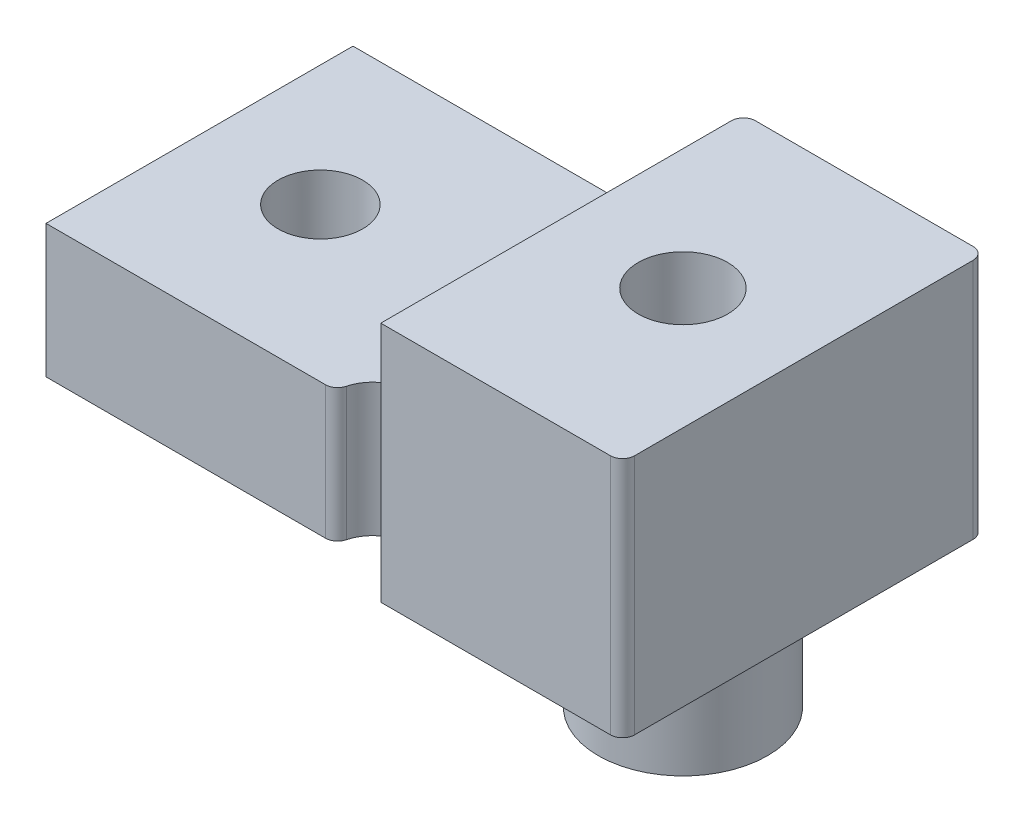
ISO-10303-21;
HEADER;
FILE_DESCRIPTION(('STEP AP214'),'2;1');
FILE_NAME('part.step','',(''),(''),'','','');
FILE_SCHEMA(('AUTOMOTIVE_DESIGN { 1 0 10303 214 1 1 1 1 }'));
ENDSEC;
DATA;
#1=APPLICATION_CONTEXT('core data for automotive mechanical design processes');
#2=APPLICATION_PROTOCOL_DEFINITION('international standard','automotive_design',2000,#1);
#3=PRODUCT_CONTEXT('',#1,'mechanical');
#4=PRODUCT('Part','Part','',(#3));
#5=PRODUCT_RELATED_PRODUCT_CATEGORY('part','',(#4));
#6=PRODUCT_DEFINITION_FORMATION('','',#4);
#7=PRODUCT_DEFINITION_CONTEXT('part definition',#1,'design');
#8=PRODUCT_DEFINITION('design','',#6,#7);
#9=PRODUCT_DEFINITION_SHAPE('','',#8);
#10=(LENGTH_UNIT() NAMED_UNIT(*) SI_UNIT(.MILLI.,.METRE.));
#11=(NAMED_UNIT(*) PLANE_ANGLE_UNIT() SI_UNIT($,.RADIAN.));
#12=(NAMED_UNIT(*) SI_UNIT($,.STERADIAN.) SOLID_ANGLE_UNIT());
#13=UNCERTAINTY_MEASURE_WITH_UNIT(LENGTH_MEASURE(1.E-05),#10,'distance_accuracy_value','');
#14=(GEOMETRIC_REPRESENTATION_CONTEXT(3) GLOBAL_UNCERTAINTY_ASSIGNED_CONTEXT((#13)) GLOBAL_UNIT_ASSIGNED_CONTEXT((#10,
#11,#12)) REPRESENTATION_CONTEXT('',''));
#15=CARTESIAN_POINT('',(0.,0.,0.));
#16=DIRECTION('',(0.,0.,1.));
#17=DIRECTION('',(1.,0.,0.));
#18=AXIS2_PLACEMENT_3D('',#15,#16,#17);
#19=CARTESIAN_POINT('',(20.,10.,-6.35));
#20=DIRECTION('',(0.,-1.,0.));
#21=DIRECTION('',(0.,0.,-1.));
#22=AXIS2_PLACEMENT_3D('',#19,#20,#21);
#23=CYLINDRICAL_SURFACE('',#22,1.85);
#24=CARTESIAN_POINT('',(20.,10.,-6.35));
#25=DIRECTION('',(0.,-1.,0.));
#26=DIRECTION('',(0.,0.,-1.));
#27=AXIS2_PLACEMENT_3D('',#24,#25,#26);
#28=CIRCLE('',#27,1.85);
#29=CARTESIAN_POINT('',(20.,10.,-8.2));
#30=VERTEX_POINT('',#29);
#31=EDGE_CURVE('E532',#30,#30,#28,.T.);
#32=ORIENTED_EDGE('',*,*,#31,.F.);
#33=EDGE_LOOP('',(#32));
#34=FACE_BOUND('',#33,.T.);
#35=CARTESIAN_POINT('',(20.,-0.999999999999999,-6.35));
#36=DIRECTION('',(0.,-1.,0.));
#37=DIRECTION('',(0.,0.,-1.));
#38=AXIS2_PLACEMENT_3D('',#35,#36,#37);
#39=CIRCLE('',#38,1.85);
#40=CARTESIAN_POINT('',(20.,-0.999999999999999,-8.2));
#41=VERTEX_POINT('',#40);
#42=EDGE_CURVE('E38',#41,#41,#39,.F.);
#43=ORIENTED_EDGE('',*,*,#42,.F.);
#44=EDGE_LOOP('',(#43));
#45=FACE_BOUND('',#44,.T.);
#46=ADVANCED_FACE('F34',(#34,#45),#23,.F.);
#47=CARTESIAN_POINT('',(13.5,0.,-12.7));
#48=DIRECTION('',(0.,-1.,0.));
#49=DIRECTION('',(0.,0.,-1.));
#50=AXIS2_PLACEMENT_3D('',#47,#48,#49);
#51=PLANE('',#50);
#52=DIRECTION('',(-1.,0.,0.));
#53=VECTOR('',#52,1.);
#54=CARTESIAN_POINT('',(0.,0.,-12.7));
#55=LINE('',#54,#53);
#56=CARTESIAN_POINT('',(11.5635083268963,0.,-12.7));
#57=VERTEX_POINT('',#56);
#58=CARTESIAN_POINT('',(0.,0.,-12.7));
#59=VERTEX_POINT('',#58);
#60=EDGE_CURVE('E254',#57,#59,#55,.T.);
#61=ORIENTED_EDGE('',*,*,#60,.F.);
#62=CARTESIAN_POINT('',(11.5635083268963,0.,-12.2));
#63=DIRECTION('',(0.,-1.,0.));
#64=DIRECTION('',(0.,0.,-1.));
#65=AXIS2_PLACEMENT_3D('',#62,#63,#64);
#66=CIRCLE('',#65,0.5);
#67=CARTESIAN_POINT('',(12.0476312451722,0.,-12.325));
#68=VERTEX_POINT('',#67);
#69=EDGE_CURVE('E191',#57,#68,#66,.T.);
#70=ORIENTED_EDGE('',*,*,#69,.T.);
#71=CARTESIAN_POINT('',(13.5,0.,-12.7));
#72=DIRECTION('',(0.,-1.,0.));
#73=DIRECTION('',(0.,0.,-1.));
#74=AXIS2_PLACEMENT_3D('',#71,#72,#73);
#75=CIRCLE('',#74,1.5);
#76=CARTESIAN_POINT('',(15.,0.,-12.7));
#77=VERTEX_POINT('',#76);
#78=EDGE_CURVE('E251',#77,#68,#75,.T.);
#79=ORIENTED_EDGE('',*,*,#78,.F.);
#80=DIRECTION('',(0.,0.,1.));
#81=VECTOR('',#80,1.);
#82=CARTESIAN_POINT('',(15.,0.,-13.85));
#83=LINE('',#82,#81);
#84=CARTESIAN_POINT('',(15.,0.,-13.35));
#85=VERTEX_POINT('',#84);
#86=EDGE_CURVE('E249',#85,#77,#83,.T.);
#87=ORIENTED_EDGE('',*,*,#86,.F.);
#88=CARTESIAN_POINT('',(15.5,0.,-13.35));
#89=DIRECTION('',(0.,-1.,0.));
#90=DIRECTION('',(0.,0.,-1.));
#91=AXIS2_PLACEMENT_3D('',#88,#89,#90);
#92=CIRCLE('',#91,0.5);
#93=CARTESIAN_POINT('',(15.5,0.,-13.85));
#94=VERTEX_POINT('',#93);
#95=EDGE_CURVE('E189',#85,#94,#92,.T.);
#96=ORIENTED_EDGE('',*,*,#95,.T.);
#97=DIRECTION('',(-1.,0.,0.));
#98=VECTOR('',#97,1.);
#99=CARTESIAN_POINT('',(15.,0.,-13.85));
#100=LINE('',#99,#98);
#101=CARTESIAN_POINT('',(24.5,0.,-13.85));
#102=VERTEX_POINT('',#101);
#103=EDGE_CURVE('E246',#102,#94,#100,.T.);
#104=ORIENTED_EDGE('',*,*,#103,.F.);
#105=CARTESIAN_POINT('',(24.5,0.,-13.35));
#106=DIRECTION('',(0.,-1.,0.));
#107=DIRECTION('',(0.,0.,-1.));
#108=AXIS2_PLACEMENT_3D('',#105,#106,#107);
#109=CIRCLE('',#108,0.5);
#110=CARTESIAN_POINT('',(25.,0.,-13.35));
#111=VERTEX_POINT('',#110);
#112=EDGE_CURVE('E187',#102,#111,#109,.T.);
#113=ORIENTED_EDGE('',*,*,#112,.T.);
#114=DIRECTION('',(0.,0.,-1.));
#115=VECTOR('',#114,1.);
#116=CARTESIAN_POINT('',(25.,0.,1.15));
#117=LINE('',#116,#115);
#118=CARTESIAN_POINT('',(25.,0.,0.65));
#119=VERTEX_POINT('',#118);
#120=EDGE_CURVE('E244',#119,#111,#117,.T.);
#121=ORIENTED_EDGE('',*,*,#120,.F.);
#122=CARTESIAN_POINT('',(24.5,0.,0.65));
#123=DIRECTION('',(0.,-1.,0.));
#124=DIRECTION('',(0.,0.,-1.));
#125=AXIS2_PLACEMENT_3D('',#122,#123,#124);
#126=CIRCLE('',#125,0.5);
#127=CARTESIAN_POINT('',(24.5,0.,1.15));
#128=VERTEX_POINT('',#127);
#129=EDGE_CURVE('E185',#119,#128,#126,.T.);
#130=ORIENTED_EDGE('',*,*,#129,.T.);
#131=DIRECTION('',(1.,0.,0.));
#132=VECTOR('',#131,1.);
#133=CARTESIAN_POINT('',(15.,0.,1.15));
#134=LINE('',#133,#132);
#135=CARTESIAN_POINT('',(15.,0.,1.15));
#136=VERTEX_POINT('',#135);
#137=EDGE_CURVE('E237',#136,#128,#134,.T.);
#138=ORIENTED_EDGE('',*,*,#137,.F.);
#139=DIRECTION('',(0.,0.,1.));
#140=VECTOR('',#139,1.);
#141=CARTESIAN_POINT('',(15.,0.,1.15));
#142=LINE('',#141,#140);
#143=CARTESIAN_POINT('',(15.,0.,0.));
#144=VERTEX_POINT('',#143);
#145=EDGE_CURVE('E234',#144,#136,#142,.T.);
#146=ORIENTED_EDGE('',*,*,#145,.F.);
#147=CARTESIAN_POINT('',(13.5,0.,0.));
#148=DIRECTION('',(0.,-1.,0.));
#149=DIRECTION('',(0.,0.,1.));
#150=AXIS2_PLACEMENT_3D('',#147,#148,#149);
#151=CIRCLE('',#150,1.5);
#152=CARTESIAN_POINT('',(12.0476312451722,0.,-0.374999999999998));
#153=VERTEX_POINT('',#152);
#154=EDGE_CURVE('E225',#153,#144,#151,.T.);
#155=ORIENTED_EDGE('',*,*,#154,.F.);
#156=CARTESIAN_POINT('',(11.5635083268963,0.,-0.499999999999998));
#157=DIRECTION('',(0.,-1.,0.));
#158=DIRECTION('',(0.,0.,-1.));
#159=AXIS2_PLACEMENT_3D('',#156,#157,#158);
#160=CIRCLE('',#159,0.5);
#161=CARTESIAN_POINT('',(11.5635083268963,0.,0.));
#162=VERTEX_POINT('',#161);
#163=EDGE_CURVE('E173',#153,#162,#160,.T.);
#164=ORIENTED_EDGE('',*,*,#163,.T.);
#165=DIRECTION('',(1.,0.,0.));
#166=VECTOR('',#165,1.);
#167=CARTESIAN_POINT('',(0.,0.,0.));
#168=LINE('',#167,#166);
#169=CARTESIAN_POINT('',(0.,0.,0.));
#170=VERTEX_POINT('',#169);
#171=EDGE_CURVE('E235',#170,#162,#168,.T.);
#172=ORIENTED_EDGE('',*,*,#171,.F.);
#173=DIRECTION('',(0.,0.,1.));
#174=VECTOR('',#173,1.);
#175=CARTESIAN_POINT('',(0.,0.,0.));
#176=LINE('',#175,#174);
#177=EDGE_CURVE('E168',#59,#170,#176,.T.);
#178=ORIENTED_EDGE('',*,*,#177,.F.);
#179=EDGE_LOOP('',(#61,#70,#79,#87,#96,#104,#113,#121,#130,#138,#146,#155,#164,#172,#178));
#180=FACE_BOUND('',#179,.T.);
#181=CARTESIAN_POINT('',(5.,0.,-6.35));
#182=DIRECTION('',(0.,1.,0.));
#183=DIRECTION('',(0.,0.,1.));
#184=AXIS2_PLACEMENT_3D('',#181,#182,#183);
#185=CIRCLE('',#184,1.75);
#186=CARTESIAN_POINT('',(5.,0.,-4.6));
#187=VERTEX_POINT('',#186);
#188=EDGE_CURVE('E283',#187,#187,#185,.T.);
#189=ORIENTED_EDGE('',*,*,#188,.T.);
#190=EDGE_LOOP('',(#189));
#191=FACE_BOUND('',#190,.T.);
#192=CARTESIAN_POINT('',(20.,0.,-6.35));
#193=DIRECTION('',(0.,-1.,0.));
#194=DIRECTION('',(0.,0.,-1.));
#195=AXIS2_PLACEMENT_3D('',#192,#193,#194);
#196=CIRCLE('',#195,3.5);
#197=CARTESIAN_POINT('',(20.,0.,-9.85));
#198=VERTEX_POINT('',#197);
#199=EDGE_CURVE('E535',#198,#198,#196,.T.);
#200=ORIENTED_EDGE('',*,*,#199,.F.);
#201=EDGE_LOOP('',(#200));
#202=FACE_BOUND('',#201,.T.);
#203=ADVANCED_FACE('F231',(#180,#191,#202),#51,.T.);
#204=CARTESIAN_POINT('',(13.5,10.,-12.7));
#205=DIRECTION('',(0.,-1.,0.));
#206=DIRECTION('',(0.,0.,-1.));
#207=AXIS2_PLACEMENT_3D('',#204,#205,#206);
#208=PLANE('',#207);
#209=ORIENTED_EDGE('',*,*,#31,.T.);
#210=EDGE_LOOP('',(#209));
#211=FACE_BOUND('',#210,.T.);
#212=DIRECTION('',(-1.,0.,0.));
#213=VECTOR('',#212,1.);
#214=CARTESIAN_POINT('',(15.,10.,-13.85));
#215=LINE('',#214,#213);
#216=CARTESIAN_POINT('',(24.5,10.,-13.85));
#217=VERTEX_POINT('',#216);
#218=CARTESIAN_POINT('',(15.5,10.,-13.85));
#219=VERTEX_POINT('',#218);
#220=EDGE_CURVE('E260',#217,#219,#215,.T.);
#221=ORIENTED_EDGE('',*,*,#220,.T.);
#222=CARTESIAN_POINT('',(15.5,10.,-13.35));
#223=DIRECTION('',(0.,-1.,0.));
#224=DIRECTION('',(0.,0.,-1.));
#225=AXIS2_PLACEMENT_3D('',#222,#223,#224);
#226=CIRCLE('',#225,0.5);
#227=CARTESIAN_POINT('',(15.,10.,-13.35));
#228=VERTEX_POINT('',#227);
#229=EDGE_CURVE('E210',#219,#228,#226,.F.);
#230=ORIENTED_EDGE('',*,*,#229,.T.);
#231=DIRECTION('',(0.,0.,1.));
#232=VECTOR('',#231,1.);
#233=CARTESIAN_POINT('',(15.,10.,1.15));
#234=LINE('',#233,#232);
#235=CARTESIAN_POINT('',(15.,10.,1.15));
#236=VERTEX_POINT('',#235);
#237=EDGE_CURVE('E256',#228,#236,#234,.T.);
#238=ORIENTED_EDGE('',*,*,#237,.T.);
#239=DIRECTION('',(1.,0.,0.));
#240=VECTOR('',#239,1.);
#241=CARTESIAN_POINT('',(15.,10.,1.15));
#242=LINE('',#241,#240);
#243=CARTESIAN_POINT('',(24.5,10.,1.15));
#244=VERTEX_POINT('',#243);
#245=EDGE_CURVE('E268',#236,#244,#242,.T.);
#246=ORIENTED_EDGE('',*,*,#245,.T.);
#247=CARTESIAN_POINT('',(24.5,10.,0.65));
#248=DIRECTION('',(0.,-1.,0.));
#249=DIRECTION('',(0.,0.,-1.));
#250=AXIS2_PLACEMENT_3D('',#247,#248,#249);
#251=CIRCLE('',#250,0.5);
#252=CARTESIAN_POINT('',(25.,10.,0.65));
#253=VERTEX_POINT('',#252);
#254=EDGE_CURVE('E57',#244,#253,#251,.F.);
#255=ORIENTED_EDGE('',*,*,#254,.T.);
#256=DIRECTION('',(0.,0.,-1.));
#257=VECTOR('',#256,1.);
#258=CARTESIAN_POINT('',(25.,10.,1.15));
#259=LINE('',#258,#257);
#260=CARTESIAN_POINT('',(25.,10.,-13.35));
#261=VERTEX_POINT('',#260);
#262=EDGE_CURVE('E276',#253,#261,#259,.T.);
#263=ORIENTED_EDGE('',*,*,#262,.T.);
#264=CARTESIAN_POINT('',(24.5,10.,-13.35));
#265=DIRECTION('',(0.,-1.,0.));
#266=DIRECTION('',(0.,0.,-1.));
#267=AXIS2_PLACEMENT_3D('',#264,#265,#266);
#268=CIRCLE('',#267,0.5);
#269=EDGE_CURVE('E208',#261,#217,#268,.F.);
#270=ORIENTED_EDGE('',*,*,#269,.T.);
#271=EDGE_LOOP('',(#221,#230,#238,#246,#255,#263,#270));
#272=FACE_BOUND('',#271,.T.);
#273=ADVANCED_FACE('F289',(#211,#272),#208,.F.);
#274=CARTESIAN_POINT('',(0.,10.,0.));
#275=DIRECTION('',(1.,0.,0.));
#276=DIRECTION('',(0.,0.,-1.));
#277=AXIS2_PLACEMENT_3D('',#274,#275,#276);
#278=PLANE('',#277);
#279=DIRECTION('',(0.,-1.,0.));
#280=VECTOR('',#279,1.);
#281=CARTESIAN_POINT('',(0.,10.,0.));
#282=LINE('',#281,#280);
#283=CARTESIAN_POINT('',(0.,5.5,0.));
#284=VERTEX_POINT('',#283);
#285=EDGE_CURVE('E160',#284,#170,#282,.T.);
#286=ORIENTED_EDGE('',*,*,#285,.F.);
#287=DIRECTION('',(0.,0.,1.));
#288=VECTOR('',#287,1.);
#289=CARTESIAN_POINT('',(0.,5.5,0.));
#290=LINE('',#289,#288);
#291=CARTESIAN_POINT('',(0.,5.5,-12.7));
#292=VERTEX_POINT('',#291);
#293=EDGE_CURVE('E143',#292,#284,#290,.T.);
#294=ORIENTED_EDGE('',*,*,#293,.F.);
#295=DIRECTION('',(0.,-1.,0.));
#296=VECTOR('',#295,1.);
#297=CARTESIAN_POINT('',(0.,10.,-12.7));
#298=LINE('',#297,#296);
#299=EDGE_CURVE('E257',#292,#59,#298,.T.);
#300=ORIENTED_EDGE('',*,*,#299,.T.);
#301=ORIENTED_EDGE('',*,*,#177,.T.);
#302=EDGE_LOOP('',(#286,#294,#300,#301));
#303=FACE_BOUND('',#302,.T.);
#304=ADVANCED_FACE('F166',(#303),#278,.F.);
#305=CARTESIAN_POINT('',(0.,10.,0.));
#306=DIRECTION('',(0.,0.,-1.));
#307=DIRECTION('',(-1.,0.,0.));
#308=AXIS2_PLACEMENT_3D('',#305,#306,#307);
#309=PLANE('',#308);
#310=ORIENTED_EDGE('',*,*,#171,.T.);
#311=DIRECTION('',(0.,-1.,0.));
#312=VECTOR('',#311,1.);
#313=CARTESIAN_POINT('',(11.5635083268963,10.,0.));
#314=LINE('',#313,#312);
#315=CARTESIAN_POINT('',(11.5635083268963,5.5,0.));
#316=VERTEX_POINT('',#315);
#317=EDGE_CURVE('E12',#162,#316,#314,.F.);
#318=ORIENTED_EDGE('',*,*,#317,.T.);
#319=DIRECTION('',(1.,0.,0.));
#320=VECTOR('',#319,1.);
#321=CARTESIAN_POINT('',(0.,5.5,0.));
#322=LINE('',#321,#320);
#323=EDGE_CURVE('E147',#284,#316,#322,.T.);
#324=ORIENTED_EDGE('',*,*,#323,.F.);
#325=ORIENTED_EDGE('',*,*,#285,.T.);
#326=EDGE_LOOP('',(#310,#318,#324,#325));
#327=FACE_BOUND('',#326,.T.);
#328=ADVANCED_FACE('F159',(#327),#309,.F.);
#329=CARTESIAN_POINT('',(13.5,10.,0.));
#330=DIRECTION('',(0.,-1.,0.));
#331=DIRECTION('',(0.,0.,-1.));
#332=AXIS2_PLACEMENT_3D('',#329,#330,#331);
#333=CYLINDRICAL_SURFACE('',#332,1.5);
#334=CARTESIAN_POINT('',(13.5,5.5,0.));
#335=DIRECTION('',(0.,-1.,0.));
#336=DIRECTION('',(0.,0.,-1.));
#337=AXIS2_PLACEMENT_3D('',#334,#335,#336);
#338=CIRCLE('',#337,1.5);
#339=CARTESIAN_POINT('',(15.,5.5,0.));
#340=VERTEX_POINT('',#339);
#341=CARTESIAN_POINT('',(12.0476312451722,5.5,-0.374999999999998));
#342=VERTEX_POINT('',#341);
#343=EDGE_CURVE('E226',#340,#342,#338,.F.);
#344=ORIENTED_EDGE('',*,*,#343,.T.);
#345=DIRECTION('',(0.,-1.,0.));
#346=VECTOR('',#345,1.);
#347=CARTESIAN_POINT('',(12.0476312451722,10.,-0.374999999999998));
#348=LINE('',#347,#346);
#349=EDGE_CURVE('E43',#342,#153,#348,.T.);
#350=ORIENTED_EDGE('',*,*,#349,.T.);
#351=ORIENTED_EDGE('',*,*,#154,.T.);
#352=DIRECTION('',(0.,-1.,0.));
#353=VECTOR('',#352,1.);
#354=CARTESIAN_POINT('',(15.,10.,0.));
#355=LINE('',#354,#353);
#356=EDGE_CURVE('E170',#340,#144,#355,.T.);
#357=ORIENTED_EDGE('',*,*,#356,.F.);
#358=EDGE_LOOP('',(#344,#350,#351,#357));
#359=FACE_BOUND('',#358,.T.);
#360=ADVANCED_FACE('F223',(#359),#333,.F.);
#361=CARTESIAN_POINT('',(15.,10.,1.15));
#362=DIRECTION('',(0.,0.,-1.));
#363=DIRECTION('',(-1.,0.,0.));
#364=AXIS2_PLACEMENT_3D('',#361,#362,#363);
#365=PLANE('',#364);
#366=ORIENTED_EDGE('',*,*,#137,.T.);
#367=DIRECTION('',(0.,-1.,0.));
#368=VECTOR('',#367,1.);
#369=CARTESIAN_POINT('',(24.5,10.,1.15));
#370=LINE('',#369,#368);
#371=EDGE_CURVE('E216',#128,#244,#370,.F.);
#372=ORIENTED_EDGE('',*,*,#371,.T.);
#373=ORIENTED_EDGE('',*,*,#245,.F.);
#374=DIRECTION('',(0.,-1.,0.));
#375=VECTOR('',#374,1.);
#376=CARTESIAN_POINT('',(15.,10.,1.15));
#377=LINE('',#376,#375);
#378=EDGE_CURVE('E176',#236,#136,#377,.T.);
#379=ORIENTED_EDGE('',*,*,#378,.T.);
#380=EDGE_LOOP('',(#366,#372,#373,#379));
#381=FACE_BOUND('',#380,.T.);
#382=ADVANCED_FACE('F266',(#381),#365,.F.);
#383=CARTESIAN_POINT('',(25.,10.,1.15));
#384=DIRECTION('',(-1.,0.,0.));
#385=DIRECTION('',(0.,0.,1.));
#386=AXIS2_PLACEMENT_3D('',#383,#384,#385);
#387=PLANE('',#386);
#388=ORIENTED_EDGE('',*,*,#120,.T.);
#389=DIRECTION('',(0.,-1.,0.));
#390=VECTOR('',#389,1.);
#391=CARTESIAN_POINT('',(25.,10.,-13.35));
#392=LINE('',#391,#390);
#393=EDGE_CURVE('E50',#111,#261,#392,.F.);
#394=ORIENTED_EDGE('',*,*,#393,.T.);
#395=ORIENTED_EDGE('',*,*,#262,.F.);
#396=DIRECTION('',(0.,-1.,0.));
#397=VECTOR('',#396,1.);
#398=CARTESIAN_POINT('',(25.,10.,0.65));
#399=LINE('',#398,#397);
#400=EDGE_CURVE('E212',#253,#119,#399,.T.);
#401=ORIENTED_EDGE('',*,*,#400,.T.);
#402=EDGE_LOOP('',(#388,#394,#395,#401));
#403=FACE_BOUND('',#402,.T.);
#404=ADVANCED_FACE('F275',(#403),#387,.F.);
#405=CARTESIAN_POINT('',(15.,10.,-13.85));
#406=DIRECTION('',(0.,0.,1.));
#407=DIRECTION('',(1.,0.,0.));
#408=AXIS2_PLACEMENT_3D('',#405,#406,#407);
#409=PLANE('',#408);
#410=ORIENTED_EDGE('',*,*,#103,.T.);
#411=DIRECTION('',(0.,-1.,0.));
#412=VECTOR('',#411,1.);
#413=CARTESIAN_POINT('',(15.5,10.,-13.85));
#414=LINE('',#413,#412);
#415=EDGE_CURVE('E205',#94,#219,#414,.F.);
#416=ORIENTED_EDGE('',*,*,#415,.T.);
#417=ORIENTED_EDGE('',*,*,#220,.F.);
#418=DIRECTION('',(0.,-1.,0.));
#419=VECTOR('',#418,1.);
#420=CARTESIAN_POINT('',(24.5,10.,-13.85));
#421=LINE('',#420,#419);
#422=EDGE_CURVE('E202',#217,#102,#421,.T.);
#423=ORIENTED_EDGE('',*,*,#422,.T.);
#424=EDGE_LOOP('',(#410,#416,#417,#423));
#425=FACE_BOUND('',#424,.T.);
#426=ADVANCED_FACE('F300',(#425),#409,.F.);
#427=CARTESIAN_POINT('',(15.,10.,-13.85));
#428=DIRECTION('',(1.,0.,0.));
#429=DIRECTION('',(0.,0.,-1.));
#430=AXIS2_PLACEMENT_3D('',#427,#428,#429);
#431=PLANE('',#430);
#432=ORIENTED_EDGE('',*,*,#237,.F.);
#433=DIRECTION('',(0.,-1.,0.));
#434=VECTOR('',#433,1.);
#435=CARTESIAN_POINT('',(15.,10.,-13.35));
#436=LINE('',#435,#434);
#437=EDGE_CURVE('E199',#228,#85,#436,.T.);
#438=ORIENTED_EDGE('',*,*,#437,.T.);
#439=ORIENTED_EDGE('',*,*,#86,.T.);
#440=DIRECTION('',(0.,-1.,0.));
#441=VECTOR('',#440,1.);
#442=CARTESIAN_POINT('',(15.,10.,-12.7));
#443=LINE('',#442,#441);
#444=CARTESIAN_POINT('',(15.,5.5,-12.7));
#445=VERTEX_POINT('',#444);
#446=EDGE_CURVE('E259',#445,#77,#443,.T.);
#447=ORIENTED_EDGE('',*,*,#446,.F.);
#448=DIRECTION('',(0.,0.,-1.));
#449=VECTOR('',#448,1.);
#450=CARTESIAN_POINT('',(15.,5.5,0.));
#451=LINE('',#450,#449);
#452=EDGE_CURVE('E163',#340,#445,#451,.T.);
#453=ORIENTED_EDGE('',*,*,#452,.F.);
#454=ORIENTED_EDGE('',*,*,#356,.T.);
#455=ORIENTED_EDGE('',*,*,#145,.T.);
#456=ORIENTED_EDGE('',*,*,#378,.F.);
#457=EDGE_LOOP('',(#432,#438,#439,#447,#453,#454,#455,#456));
#458=FACE_BOUND('',#457,.T.);
#459=ADVANCED_FACE('F292',(#458),#431,.F.);
#460=CARTESIAN_POINT('',(13.5,10.,-12.7));
#461=DIRECTION('',(0.,-1.,0.));
#462=DIRECTION('',(0.,0.,-1.));
#463=AXIS2_PLACEMENT_3D('',#460,#461,#462);
#464=CYLINDRICAL_SURFACE('',#463,1.5);
#465=ORIENTED_EDGE('',*,*,#78,.T.);
#466=DIRECTION('',(0.,-1.,0.));
#467=VECTOR('',#466,1.);
#468=CARTESIAN_POINT('',(12.0476312451722,10.,-12.325));
#469=LINE('',#468,#467);
#470=CARTESIAN_POINT('',(12.0476312451722,5.5,-12.325));
#471=VERTEX_POINT('',#470);
#472=EDGE_CURVE('E193',#68,#471,#469,.F.);
#473=ORIENTED_EDGE('',*,*,#472,.T.);
#474=CARTESIAN_POINT('',(13.5,5.5,-12.7));
#475=DIRECTION('',(0.,-1.,0.));
#476=DIRECTION('',(0.,0.,-1.));
#477=AXIS2_PLACEMENT_3D('',#474,#475,#476);
#478=CIRCLE('',#477,1.5);
#479=EDGE_CURVE('E182',#471,#445,#478,.F.);
#480=ORIENTED_EDGE('',*,*,#479,.T.);
#481=ORIENTED_EDGE('',*,*,#446,.T.);
#482=EDGE_LOOP('',(#465,#473,#480,#481));
#483=FACE_BOUND('',#482,.T.);
#484=ADVANCED_FACE('F348',(#483),#464,.F.);
#485=CARTESIAN_POINT('',(0.,10.,-12.7));
#486=DIRECTION('',(0.,0.,1.));
#487=DIRECTION('',(1.,0.,0.));
#488=AXIS2_PLACEMENT_3D('',#485,#486,#487);
#489=PLANE('',#488);
#490=DIRECTION('',(-1.,0.,0.));
#491=VECTOR('',#490,1.);
#492=CARTESIAN_POINT('',(0.,5.5,-12.7));
#493=LINE('',#492,#491);
#494=CARTESIAN_POINT('',(11.5635083268963,5.5,-12.7));
#495=VERTEX_POINT('',#494);
#496=EDGE_CURVE('E150',#495,#292,#493,.T.);
#497=ORIENTED_EDGE('',*,*,#496,.F.);
#498=DIRECTION('',(0.,-1.,0.));
#499=VECTOR('',#498,1.);
#500=CARTESIAN_POINT('',(11.5635083268963,10.,-12.7));
#501=LINE('',#500,#499);
#502=EDGE_CURVE('E169',#495,#57,#501,.T.);
#503=ORIENTED_EDGE('',*,*,#502,.T.);
#504=ORIENTED_EDGE('',*,*,#60,.T.);
#505=ORIENTED_EDGE('',*,*,#299,.F.);
#506=EDGE_LOOP('',(#497,#503,#504,#505));
#507=FACE_BOUND('',#506,.T.);
#508=ADVANCED_FACE('F341',(#507),#489,.F.);
#509=CARTESIAN_POINT('',(5.,10.,-6.35));
#510=DIRECTION('',(0.,-1.,0.));
#511=DIRECTION('',(0.,0.,-1.));
#512=AXIS2_PLACEMENT_3D('',#509,#510,#511);
#513=CYLINDRICAL_SURFACE('',#512,1.75);
#514=CARTESIAN_POINT('',(5.,5.5,-6.35));
#515=DIRECTION('',(0.,-1.,0.));
#516=DIRECTION('',(0.,0.,-1.));
#517=AXIS2_PLACEMENT_3D('',#514,#515,#516);
#518=CIRCLE('',#517,1.75);
#519=CARTESIAN_POINT('',(5.,5.5,-8.1));
#520=VERTEX_POINT('',#519);
#521=EDGE_CURVE('E180',#520,#520,#518,.T.);
#522=ORIENTED_EDGE('',*,*,#521,.F.);
#523=EDGE_LOOP('',(#522));
#524=FACE_BOUND('',#523,.T.);
#525=ORIENTED_EDGE('',*,*,#188,.F.);
#526=EDGE_LOOP('',(#525));
#527=FACE_BOUND('',#526,.T.);
#528=ADVANCED_FACE('F337',(#524,#527),#513,.F.);
#529=CARTESIAN_POINT('',(0.,5.5,0.));
#530=DIRECTION('',(0.,-1.,0.));
#531=DIRECTION('',(0.,0.,-1.));
#532=AXIS2_PLACEMENT_3D('',#529,#530,#531);
#533=PLANE('',#532);
#534=ORIENTED_EDGE('',*,*,#521,.T.);
#535=EDGE_LOOP('',(#534));
#536=FACE_BOUND('',#535,.T.);
#537=ORIENTED_EDGE('',*,*,#479,.F.);
#538=CARTESIAN_POINT('',(11.5635083268963,5.5,-12.2));
#539=DIRECTION('',(0.,-1.,0.));
#540=DIRECTION('',(0.,0.,-1.));
#541=AXIS2_PLACEMENT_3D('',#538,#539,#540);
#542=CIRCLE('',#541,0.5);
#543=EDGE_CURVE('E197',#471,#495,#542,.F.);
#544=ORIENTED_EDGE('',*,*,#543,.T.);
#545=ORIENTED_EDGE('',*,*,#496,.T.);
#546=ORIENTED_EDGE('',*,*,#293,.T.);
#547=ORIENTED_EDGE('',*,*,#323,.T.);
#548=CARTESIAN_POINT('',(11.5635083268963,5.5,-0.499999999999998));
#549=DIRECTION('',(0.,-1.,0.));
#550=DIRECTION('',(0.,0.,-1.));
#551=AXIS2_PLACEMENT_3D('',#548,#549,#550);
#552=CIRCLE('',#551,0.5);
#553=EDGE_CURVE('E195',#316,#342,#552,.F.);
#554=ORIENTED_EDGE('',*,*,#553,.T.);
#555=ORIENTED_EDGE('',*,*,#343,.F.);
#556=ORIENTED_EDGE('',*,*,#452,.T.);
#557=EDGE_LOOP('',(#537,#544,#545,#546,#547,#554,#555,#556));
#558=FACE_BOUND('',#557,.T.);
#559=ADVANCED_FACE('F146',(#536,#558),#533,.F.);
#560=CARTESIAN_POINT('',(11.5635083268963,10.,-12.2));
#561=DIRECTION('',(0.,-1.,0.));
#562=DIRECTION('',(0.,0.,-1.));
#563=AXIS2_PLACEMENT_3D('',#560,#561,#562);
#564=CYLINDRICAL_SURFACE('',#563,0.5);
#565=ORIENTED_EDGE('',*,*,#543,.F.);
#566=ORIENTED_EDGE('',*,*,#472,.F.);
#567=ORIENTED_EDGE('',*,*,#69,.F.);
#568=ORIENTED_EDGE('',*,*,#502,.F.);
#569=EDGE_LOOP('',(#565,#566,#567,#568));
#570=FACE_BOUND('',#569,.T.);
#571=ADVANCED_FACE('F311',(#570),#564,.T.);
#572=CARTESIAN_POINT('',(15.5,10.,-13.35));
#573=DIRECTION('',(0.,-1.,0.));
#574=DIRECTION('',(0.,0.,-1.));
#575=AXIS2_PLACEMENT_3D('',#572,#573,#574);
#576=CYLINDRICAL_SURFACE('',#575,0.5);
#577=ORIENTED_EDGE('',*,*,#229,.F.);
#578=ORIENTED_EDGE('',*,*,#415,.F.);
#579=ORIENTED_EDGE('',*,*,#95,.F.);
#580=ORIENTED_EDGE('',*,*,#437,.F.);
#581=EDGE_LOOP('',(#577,#578,#579,#580));
#582=FACE_BOUND('',#581,.T.);
#583=ADVANCED_FACE('F295',(#582),#576,.T.);
#584=CARTESIAN_POINT('',(24.5,10.,-13.35));
#585=DIRECTION('',(0.,-1.,0.));
#586=DIRECTION('',(0.,0.,-1.));
#587=AXIS2_PLACEMENT_3D('',#584,#585,#586);
#588=CYLINDRICAL_SURFACE('',#587,0.5);
#589=ORIENTED_EDGE('',*,*,#269,.F.);
#590=ORIENTED_EDGE('',*,*,#393,.F.);
#591=ORIENTED_EDGE('',*,*,#112,.F.);
#592=ORIENTED_EDGE('',*,*,#422,.F.);
#593=EDGE_LOOP('',(#589,#590,#591,#592));
#594=FACE_BOUND('',#593,.T.);
#595=ADVANCED_FACE('F304',(#594),#588,.T.);
#596=CARTESIAN_POINT('',(24.5,10.,0.65));
#597=DIRECTION('',(0.,-1.,0.));
#598=DIRECTION('',(0.,0.,-1.));
#599=AXIS2_PLACEMENT_3D('',#596,#597,#598);
#600=CYLINDRICAL_SURFACE('',#599,0.5);
#601=ORIENTED_EDGE('',*,*,#254,.F.);
#602=ORIENTED_EDGE('',*,*,#371,.F.);
#603=ORIENTED_EDGE('',*,*,#129,.F.);
#604=ORIENTED_EDGE('',*,*,#400,.F.);
#605=EDGE_LOOP('',(#601,#602,#603,#604));
#606=FACE_BOUND('',#605,.T.);
#607=ADVANCED_FACE('F274',(#606),#600,.T.);
#608=CARTESIAN_POINT('',(11.5635083268963,10.,-0.499999999999998));
#609=DIRECTION('',(0.,-1.,0.));
#610=DIRECTION('',(0.,0.,-1.));
#611=AXIS2_PLACEMENT_3D('',#608,#609,#610);
#612=CYLINDRICAL_SURFACE('',#611,0.5);
#613=ORIENTED_EDGE('',*,*,#553,.F.);
#614=ORIENTED_EDGE('',*,*,#317,.F.);
#615=ORIENTED_EDGE('',*,*,#163,.F.);
#616=ORIENTED_EDGE('',*,*,#349,.F.);
#617=EDGE_LOOP('',(#613,#614,#615,#616));
#618=FACE_BOUND('',#617,.T.);
#619=ADVANCED_FACE('F36',(#618),#612,.T.);
#620=CARTESIAN_POINT('',(20.,-29.8994949366117,-6.35));
#621=DIRECTION('',(0.,1.,0.));
#622=DIRECTION('',(0.,0.,1.));
#623=AXIS2_PLACEMENT_3D('',#620,#621,#622);
#624=CYLINDRICAL_SURFACE('',#623,3.5);
#625=ORIENTED_EDGE('',*,*,#199,.T.);
#626=EDGE_LOOP('',(#625));
#627=FACE_BOUND('',#626,.T.);
#628=CARTESIAN_POINT('',(20.,-5.,-6.35));
#629=DIRECTION('',(0.,-1.,0.));
#630=DIRECTION('',(0.,0.,-1.));
#631=AXIS2_PLACEMENT_3D('',#628,#629,#630);
#632=CIRCLE('',#631,3.5);
#633=CARTESIAN_POINT('',(20.,-5.,-9.85));
#634=VERTEX_POINT('',#633);
#635=EDGE_CURVE('E155',#634,#634,#632,.T.);
#636=ORIENTED_EDGE('',*,*,#635,.F.);
#637=EDGE_LOOP('',(#636));
#638=FACE_BOUND('',#637,.T.);
#639=ADVANCED_FACE('F330',(#627,#638),#624,.T.);
#640=CARTESIAN_POINT('',(13.5,-5.,-12.7));
#641=DIRECTION('',(0.,-1.,0.));
#642=DIRECTION('',(0.,0.,-1.));
#643=AXIS2_PLACEMENT_3D('',#640,#641,#642);
#644=PLANE('',#643);
#645=CARTESIAN_POINT('',(20.,-5.,-6.35));
#646=DIRECTION('',(0.,-1.,0.));
#647=DIRECTION('',(0.,0.,-1.));
#648=AXIS2_PLACEMENT_3D('',#645,#646,#647);
#649=CIRCLE('',#648,1.95);
#650=CARTESIAN_POINT('',(20.,-5.,-8.3));
#651=VERTEX_POINT('',#650);
#652=EDGE_CURVE('E528',#651,#651,#649,.T.);
#653=ORIENTED_EDGE('',*,*,#652,.F.);
#654=EDGE_LOOP('',(#653));
#655=FACE_BOUND('',#654,.T.);
#656=ORIENTED_EDGE('',*,*,#635,.T.);
#657=EDGE_LOOP('',(#656));
#658=FACE_BOUND('',#657,.T.);
#659=ADVANCED_FACE('F326',(#655,#658),#644,.T.);
#660=CARTESIAN_POINT('',(20.,-0.999999999999999,-6.35));
#661=DIRECTION('',(0.,-1.,0.));
#662=DIRECTION('',(0.,0.,-1.));
#663=AXIS2_PLACEMENT_3D('',#660,#661,#662);
#664=PLANE('',#663);
#665=CARTESIAN_POINT('',(20.,-0.999999999999999,-6.35));
#666=DIRECTION('',(0.,-1.,0.));
#667=DIRECTION('',(0.,0.,-1.));
#668=AXIS2_PLACEMENT_3D('',#665,#666,#667);
#669=CIRCLE('',#668,1.95);
#670=CARTESIAN_POINT('',(20.,-0.999999999999999,-8.3));
#671=VERTEX_POINT('',#670);
#672=EDGE_CURVE('E525',#671,#671,#669,.T.);
#673=ORIENTED_EDGE('',*,*,#672,.T.);
#674=EDGE_LOOP('',(#673));
#675=FACE_BOUND('',#674,.T.);
#676=ORIENTED_EDGE('',*,*,#42,.T.);
#677=EDGE_LOOP('',(#676));
#678=FACE_BOUND('',#677,.T.);
#679=ADVANCED_FACE('F329',(#675,#678),#664,.T.);
#680=CARTESIAN_POINT('',(20.,-0.999999999999999,-6.35));
#681=DIRECTION('',(0.,-1.,0.));
#682=DIRECTION('',(0.,0.,-1.));
#683=AXIS2_PLACEMENT_3D('',#680,#681,#682);
#684=CYLINDRICAL_SURFACE('',#683,1.95);
#685=ORIENTED_EDGE('',*,*,#672,.F.);
#686=EDGE_LOOP('',(#685));
#687=FACE_BOUND('',#686,.T.);
#688=ORIENTED_EDGE('',*,*,#652,.T.);
#689=EDGE_LOOP('',(#688));
#690=FACE_BOUND('',#689,.T.);
#691=ADVANCED_FACE('F324',(#687,#690),#684,.F.);
#692=CLOSED_SHELL('',(#46,#203,#273,#304,#328,#360,#382,#404,#426,#459,#484,#508,#528,#559,#571,
#583,#595,#607,#619,#639,#659,#679,#691));
#693=MANIFOLD_SOLID_BREP('B2',#692);
#694=ADVANCED_BREP_SHAPE_REPRESENTATION('',(#18,#693),#14);
#695=SHAPE_DEFINITION_REPRESENTATION(#9,#694);
ENDSEC;
END-ISO-10303-21;
